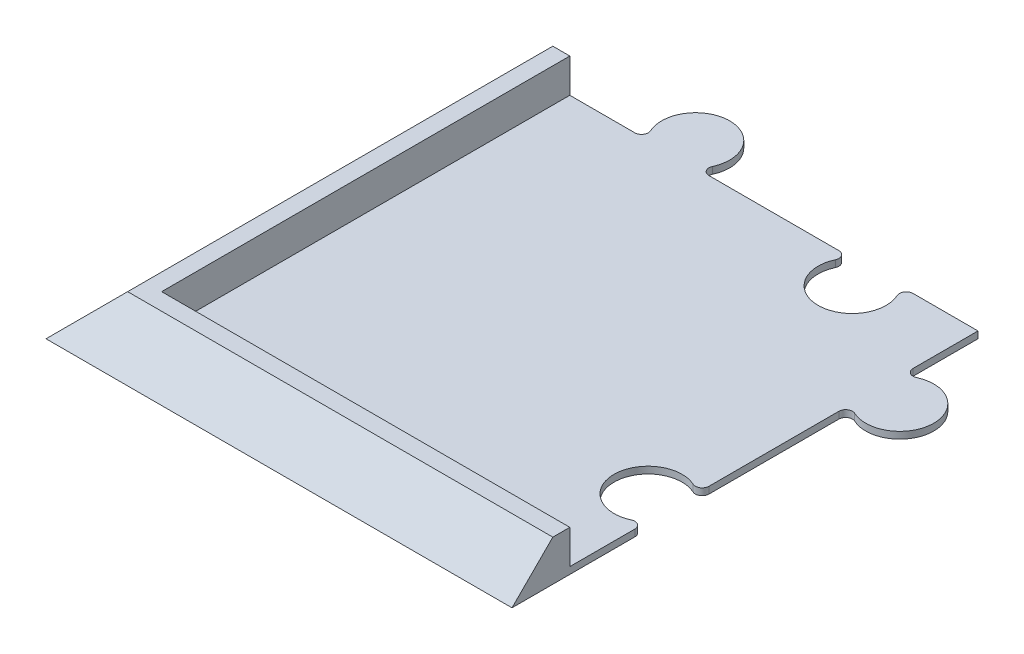
ISO-10303-21;
HEADER;
FILE_DESCRIPTION(('STEP AP214'),'2;1');
FILE_NAME('part.step','',(''),(''),'','','');
FILE_SCHEMA(('AUTOMOTIVE_DESIGN { 1 0 10303 214 1 1 1 1 }'));
ENDSEC;
DATA;
#1=APPLICATION_CONTEXT('core data for automotive mechanical design processes');
#2=APPLICATION_PROTOCOL_DEFINITION('international standard','automotive_design',2000,#1);
#3=PRODUCT_CONTEXT('',#1,'mechanical');
#4=PRODUCT('Part','Part','',(#3));
#5=PRODUCT_RELATED_PRODUCT_CATEGORY('part','',(#4));
#6=PRODUCT_DEFINITION_FORMATION('','',#4);
#7=PRODUCT_DEFINITION_CONTEXT('part definition',#1,'design');
#8=PRODUCT_DEFINITION('design','',#6,#7);
#9=PRODUCT_DEFINITION_SHAPE('','',#8);
#10=(LENGTH_UNIT() NAMED_UNIT(*) SI_UNIT(.MILLI.,.METRE.));
#11=(NAMED_UNIT(*) PLANE_ANGLE_UNIT() SI_UNIT($,.RADIAN.));
#12=(NAMED_UNIT(*) SI_UNIT($,.STERADIAN.) SOLID_ANGLE_UNIT());
#13=UNCERTAINTY_MEASURE_WITH_UNIT(LENGTH_MEASURE(1.E-05),#10,'distance_accuracy_value','');
#14=(GEOMETRIC_REPRESENTATION_CONTEXT(3) GLOBAL_UNCERTAINTY_ASSIGNED_CONTEXT((#13)) GLOBAL_UNIT_ASSIGNED_CONTEXT((#10,
#11,#12)) REPRESENTATION_CONTEXT('',''));
#15=CARTESIAN_POINT('',(0.,0.,0.));
#16=DIRECTION('',(0.,0.,1.));
#17=DIRECTION('',(1.,0.,0.));
#18=AXIS2_PLACEMENT_3D('',#15,#16,#17);
#19=CARTESIAN_POINT('',(0.,2.54,152.4));
#20=DIRECTION('',(1.,0.,0.));
#21=DIRECTION('',(0.,0.,-1.));
#22=AXIS2_PLACEMENT_3D('',#19,#20,#21);
#23=PLANE('',#22);
#24=DIRECTION('',(0.,0.,-1.));
#25=VECTOR('',#24,1.);
#26=CARTESIAN_POINT('',(0.,2.54,152.4));
#27=LINE('',#26,#25);
#28=CARTESIAN_POINT('',(0.,2.54,100.445935614413));
#29=VERTEX_POINT('',#28);
#30=CARTESIAN_POINT('',(0.,2.54,51.9540643855874));
#31=VERTEX_POINT('',#30);
#32=EDGE_CURVE('E283',#29,#31,#27,.T.);
#33=ORIENTED_EDGE('',*,*,#32,.F.);
#34=DIRECTION('',(0.,-1.,0.));
#35=VECTOR('',#34,1.);
#36=CARTESIAN_POINT('',(0.,0.,100.445935614413));
#37=LINE('',#36,#35);
#38=CARTESIAN_POINT('',(0.,0.,100.445935614413));
#39=VERTEX_POINT('',#38);
#40=EDGE_CURVE('E328',#29,#39,#37,.T.);
#41=ORIENTED_EDGE('',*,*,#40,.T.);
#42=DIRECTION('',(0.,0.,-1.));
#43=VECTOR('',#42,1.);
#44=CARTESIAN_POINT('',(0.,0.,152.4));
#45=LINE('',#44,#43);
#46=CARTESIAN_POINT('',(0.,0.,51.9540643855874));
#47=VERTEX_POINT('',#46);
#48=EDGE_CURVE('E277',#39,#47,#45,.T.);
#49=ORIENTED_EDGE('',*,*,#48,.T.);
#50=DIRECTION('',(0.,1.,0.));
#51=VECTOR('',#50,1.);
#52=CARTESIAN_POINT('',(0.,2.54,51.9540643855874));
#53=LINE('',#52,#51);
#54=EDGE_CURVE('E324',#47,#31,#53,.T.);
#55=ORIENTED_EDGE('',*,*,#54,.T.);
#56=EDGE_LOOP('',(#33,#41,#49,#55));
#57=FACE_BOUND('',#56,.T.);
#58=ADVANCED_FACE('F41',(#57),#23,.T.);
#59=CARTESIAN_POINT('',(0.,0.,0.));
#60=DIRECTION('',(0.,0.,-1.));
#61=DIRECTION('',(-1.,0.,0.));
#62=AXIS2_PLACEMENT_3D('',#59,#60,#61);
#63=PLANE('',#62);
#64=DIRECTION('',(1.,0.,0.));
#65=VECTOR('',#64,1.);
#66=CARTESIAN_POINT('',(-152.4,2.54,0.));
#67=LINE('',#66,#65);
#68=CARTESIAN_POINT('',(-100.445935614413,2.54,0.));
#69=VERTEX_POINT('',#68);
#70=CARTESIAN_POINT('',(-51.9540643855874,2.54,0.));
#71=VERTEX_POINT('',#70);
#72=EDGE_CURVE('E260',#69,#71,#67,.T.);
#73=ORIENTED_EDGE('',*,*,#72,.T.);
#74=DIRECTION('',(0.,-1.,0.));
#75=VECTOR('',#74,1.);
#76=CARTESIAN_POINT('',(-51.9540643855874,0.,0.));
#77=LINE('',#76,#75);
#78=CARTESIAN_POINT('',(-51.9540643855874,0.,0.));
#79=VERTEX_POINT('',#78);
#80=EDGE_CURVE('E64',#71,#79,#77,.T.);
#81=ORIENTED_EDGE('',*,*,#80,.T.);
#82=DIRECTION('',(-1.,0.,0.));
#83=VECTOR('',#82,1.);
#84=CARTESIAN_POINT('',(0.,0.,0.));
#85=LINE('',#84,#83);
#86=CARTESIAN_POINT('',(-100.445935614413,0.,0.));
#87=VERTEX_POINT('',#86);
#88=EDGE_CURVE('E269',#79,#87,#85,.T.);
#89=ORIENTED_EDGE('',*,*,#88,.T.);
#90=DIRECTION('',(0.,1.,0.));
#91=VECTOR('',#90,1.);
#92=CARTESIAN_POINT('',(-100.445935614413,0.,0.));
#93=LINE('',#92,#91);
#94=EDGE_CURVE('E352',#87,#69,#93,.T.);
#95=ORIENTED_EDGE('',*,*,#94,.T.);
#96=EDGE_LOOP('',(#73,#81,#89,#95));
#97=FACE_BOUND('',#96,.T.);
#98=ADVANCED_FACE('F505',(#97),#63,.T.);
#99=CARTESIAN_POINT('',(0.,2.54,24.2459356144127));
#100=VERTEX_POINT('',#99);
#101=CARTESIAN_POINT('',(0.,2.54,0.));
#102=VERTEX_POINT('',#101);
#103=EDGE_CURVE('E284',#100,#102,#27,.T.);
#104=ORIENTED_EDGE('',*,*,#103,.F.);
#105=DIRECTION('',(0.,1.,0.));
#106=VECTOR('',#105,1.);
#107=CARTESIAN_POINT('',(0.,2.54,24.2459356144127));
#108=LINE('',#107,#106);
#109=CARTESIAN_POINT('',(0.,0.,24.2459356144127));
#110=VERTEX_POINT('',#109);
#111=EDGE_CURVE('E338',#100,#110,#108,.F.);
#112=ORIENTED_EDGE('',*,*,#111,.T.);
#113=CARTESIAN_POINT('',(0.,0.,0.));
#114=VERTEX_POINT('',#113);
#115=EDGE_CURVE('E278',#110,#114,#45,.T.);
#116=ORIENTED_EDGE('',*,*,#115,.T.);
#117=DIRECTION('',(0.,-1.,0.));
#118=VECTOR('',#117,1.);
#119=CARTESIAN_POINT('',(0.,2.54,0.));
#120=LINE('',#119,#118);
#121=EDGE_CURVE('E259',#102,#114,#120,.T.);
#122=ORIENTED_EDGE('',*,*,#121,.F.);
#123=EDGE_LOOP('',(#104,#112,#116,#122));
#124=FACE_BOUND('',#123,.T.);
#125=ADVANCED_FACE('F475',(#124),#23,.T.);
#126=CARTESIAN_POINT('',(0.,0.,173.99));
#127=VERTEX_POINT('',#126);
#128=CARTESIAN_POINT('',(0.,0.,128.154064385587));
#129=VERTEX_POINT('',#128);
#130=EDGE_CURVE('E210',#127,#129,#45,.T.);
#131=ORIENTED_EDGE('',*,*,#130,.T.);
#132=DIRECTION('',(0.,-1.,0.));
#133=VECTOR('',#132,1.);
#134=CARTESIAN_POINT('',(0.,2.54,128.154064385587));
#135=LINE('',#134,#133);
#136=CARTESIAN_POINT('',(0.,2.54,128.154064385587));
#137=VERTEX_POINT('',#136);
#138=EDGE_CURVE('E273',#129,#137,#135,.F.);
#139=ORIENTED_EDGE('',*,*,#138,.T.);
#140=CARTESIAN_POINT('',(0.,2.54,152.4));
#141=VERTEX_POINT('',#140);
#142=EDGE_CURVE('E279',#141,#137,#27,.T.);
#143=ORIENTED_EDGE('',*,*,#142,.F.);
#144=DIRECTION('',(0.,1.,0.));
#145=VECTOR('',#144,1.);
#146=CARTESIAN_POINT('',(0.,2.54,152.4));
#147=LINE('',#146,#145);
#148=CARTESIAN_POINT('',(0.,15.24,152.4));
#149=VERTEX_POINT('',#148);
#150=EDGE_CURVE('E220',#141,#149,#147,.T.);
#151=ORIENTED_EDGE('',*,*,#150,.T.);
#152=DIRECTION('',(0.,0.,1.));
#153=VECTOR('',#152,1.);
#154=CARTESIAN_POINT('',(0.,15.24,152.4));
#155=LINE('',#154,#153);
#156=CARTESIAN_POINT('',(0.,15.24,158.75));
#157=VERTEX_POINT('',#156);
#158=EDGE_CURVE('E414',#149,#157,#155,.T.);
#159=ORIENTED_EDGE('',*,*,#158,.T.);
#160=DIRECTION('',(0.,-0.707106781186544,0.707106781186551));
#161=VECTOR('',#160,1.);
#162=CARTESIAN_POINT('',(0.,15.24,158.75));
#163=LINE('',#162,#161);
#164=EDGE_CURVE('E237',#157,#127,#163,.T.);
#165=ORIENTED_EDGE('',*,*,#164,.T.);
#166=EDGE_LOOP('',(#131,#139,#143,#151,#159,#165));
#167=FACE_BOUND('',#166,.T.);
#168=ADVANCED_FACE('F420',(#167),#23,.T.);
#169=CARTESIAN_POINT('',(-152.4,2.54,0.));
#170=VERTEX_POINT('',#169);
#171=CARTESIAN_POINT('',(-128.154064385587,2.54,0.));
#172=VERTEX_POINT('',#171);
#173=EDGE_CURVE('E255',#170,#172,#67,.T.);
#174=ORIENTED_EDGE('',*,*,#173,.T.);
#175=DIRECTION('',(0.,1.,0.));
#176=VECTOR('',#175,1.);
#177=CARTESIAN_POINT('',(-128.154064385587,0.,0.));
#178=LINE('',#177,#176);
#179=CARTESIAN_POINT('',(-128.154064385587,0.,0.));
#180=VERTEX_POINT('',#179);
#181=EDGE_CURVE('E365',#172,#180,#178,.F.);
#182=ORIENTED_EDGE('',*,*,#181,.T.);
#183=CARTESIAN_POINT('',(-173.99,0.,0.));
#184=VERTEX_POINT('',#183);
#185=EDGE_CURVE('E264',#180,#184,#85,.T.);
#186=ORIENTED_EDGE('',*,*,#185,.T.);
#187=DIRECTION('',(0.707106781186551,0.707106781186544,0.));
#188=VECTOR('',#187,1.);
#189=CARTESIAN_POINT('',(-173.99,0.,0.));
#190=LINE('',#189,#188);
#191=CARTESIAN_POINT('',(-158.75,15.24,0.));
#192=VERTEX_POINT('',#191);
#193=EDGE_CURVE('E205',#184,#192,#190,.T.);
#194=ORIENTED_EDGE('',*,*,#193,.T.);
#195=DIRECTION('',(1.,0.,0.));
#196=VECTOR('',#195,1.);
#197=CARTESIAN_POINT('',(-158.75,15.24,0.));
#198=LINE('',#197,#196);
#199=CARTESIAN_POINT('',(-152.4,15.24,0.));
#200=VERTEX_POINT('',#199);
#201=EDGE_CURVE('E227',#192,#200,#198,.T.);
#202=ORIENTED_EDGE('',*,*,#201,.T.);
#203=DIRECTION('',(0.,-1.,0.));
#204=VECTOR('',#203,1.);
#205=CARTESIAN_POINT('',(-152.4,15.24,0.));
#206=LINE('',#205,#204);
#207=EDGE_CURVE('E232',#200,#170,#206,.T.);
#208=ORIENTED_EDGE('',*,*,#207,.T.);
#209=EDGE_LOOP('',(#174,#182,#186,#194,#202,#208));
#210=FACE_BOUND('',#209,.T.);
#211=ADVANCED_FACE('F396',(#210),#63,.T.);
#212=CARTESIAN_POINT('',(-24.2459356144126,0.,0.));
#213=VERTEX_POINT('',#212);
#214=EDGE_CURVE('E265',#114,#213,#85,.T.);
#215=ORIENTED_EDGE('',*,*,#214,.T.);
#216=DIRECTION('',(0.,-1.,0.));
#217=VECTOR('',#216,1.);
#218=CARTESIAN_POINT('',(-24.2459356144126,2.54,0.));
#219=LINE('',#218,#217);
#220=CARTESIAN_POINT('',(-24.2459356144127,2.54,0.));
#221=VERTEX_POINT('',#220);
#222=EDGE_CURVE('E341',#213,#221,#219,.F.);
#223=ORIENTED_EDGE('',*,*,#222,.T.);
#224=EDGE_CURVE('E254',#221,#102,#67,.T.);
#225=ORIENTED_EDGE('',*,*,#224,.T.);
#226=ORIENTED_EDGE('',*,*,#121,.T.);
#227=EDGE_LOOP('',(#215,#223,#225,#226));
#228=FACE_BOUND('',#227,.T.);
#229=ADVANCED_FACE('F469',(#228),#63,.T.);
#230=CARTESIAN_POINT('',(-158.75,15.24,152.4));
#231=DIRECTION('',(0.,1.,0.));
#232=DIRECTION('',(-1.,0.,0.));
#233=AXIS2_PLACEMENT_3D('',#230,#231,#232);
#234=PLANE('',#233);
#235=DIRECTION('',(0.,0.,-1.));
#236=VECTOR('',#235,1.);
#237=CARTESIAN_POINT('',(-158.75,15.24,152.4));
#238=LINE('',#237,#236);
#239=CARTESIAN_POINT('',(-158.75,15.24,158.75));
#240=VERTEX_POINT('',#239);
#241=EDGE_CURVE('E209',#240,#192,#238,.T.);
#242=ORIENTED_EDGE('',*,*,#241,.F.);
#243=DIRECTION('',(1.,0.,0.));
#244=VECTOR('',#243,1.);
#245=CARTESIAN_POINT('',(-173.99,15.24,158.75));
#246=LINE('',#245,#244);
#247=EDGE_CURVE('E218',#240,#157,#246,.T.);
#248=ORIENTED_EDGE('',*,*,#247,.T.);
#249=ORIENTED_EDGE('',*,*,#158,.F.);
#250=DIRECTION('',(1.,0.,0.));
#251=VECTOR('',#250,1.);
#252=CARTESIAN_POINT('',(-173.99,15.24,152.4));
#253=LINE('',#252,#251);
#254=CARTESIAN_POINT('',(-152.4,15.24,152.4));
#255=VERTEX_POINT('',#254);
#256=EDGE_CURVE('E234',#255,#149,#253,.T.);
#257=ORIENTED_EDGE('',*,*,#256,.F.);
#258=DIRECTION('',(0.,0.,-1.));
#259=VECTOR('',#258,1.);
#260=CARTESIAN_POINT('',(-152.4,15.24,152.4));
#261=LINE('',#260,#259);
#262=EDGE_CURVE('E249',#255,#200,#261,.T.);
#263=ORIENTED_EDGE('',*,*,#262,.T.);
#264=ORIENTED_EDGE('',*,*,#201,.F.);
#265=EDGE_LOOP('',(#242,#248,#249,#257,#263,#264));
#266=FACE_BOUND('',#265,.T.);
#267=ADVANCED_FACE('F534',(#266),#234,.T.);
#268=CARTESIAN_POINT('',(-173.99,0.,152.4));
#269=DIRECTION('',(-0.707106781186544,0.707106781186551,0.));
#270=DIRECTION('',(-0.707106781186551,-0.707106781186544,0.));
#271=AXIS2_PLACEMENT_3D('',#268,#269,#270);
#272=PLANE('',#271);
#273=ORIENTED_EDGE('',*,*,#193,.F.);
#274=DIRECTION('',(0.,0.,-1.));
#275=VECTOR('',#274,1.);
#276=CARTESIAN_POINT('',(-173.99,0.,152.4));
#277=LINE('',#276,#275);
#278=CARTESIAN_POINT('',(-173.99,0.,173.99));
#279=VERTEX_POINT('',#278);
#280=EDGE_CURVE('E199',#279,#184,#277,.T.);
#281=ORIENTED_EDGE('',*,*,#280,.F.);
#282=DIRECTION('',(0.577350269189628,0.577350269189621,-0.577350269189628));
#283=VECTOR('',#282,1.);
#284=CARTESIAN_POINT('',(-163.83,10.16,163.83));
#285=LINE('',#284,#283);
#286=EDGE_CURVE('E202',#279,#240,#285,.T.);
#287=ORIENTED_EDGE('',*,*,#286,.T.);
#288=ORIENTED_EDGE('',*,*,#241,.T.);
#289=EDGE_LOOP('',(#273,#281,#287,#288));
#290=FACE_BOUND('',#289,.T.);
#291=ADVANCED_FACE('F201',(#290),#272,.T.);
#292=CARTESIAN_POINT('',(0.,0.,152.4));
#293=DIRECTION('',(0.,-1.,0.));
#294=DIRECTION('',(1.,0.,0.));
#295=AXIS2_PLACEMENT_3D('',#292,#293,#294);
#296=PLANE('',#295);
#297=CARTESIAN_POINT('',(-8.89,0.,114.3));
#298=DIRECTION('',(0.,1.,0.));
#299=DIRECTION('',(0.,0.,1.));
#300=AXIS2_PLACEMENT_3D('',#297,#298,#299);
#301=CIRCLE('',#300,12.7);
#302=CARTESIAN_POINT('',(-3.59833333333334,0.,102.754946345344));
#303=VERTEX_POINT('',#302);
#304=CARTESIAN_POINT('',(-3.59833333333333,0.,125.845053654656));
#305=VERTEX_POINT('',#304);
#306=EDGE_CURVE('E435',#303,#305,#301,.T.);
#307=ORIENTED_EDGE('',*,*,#306,.T.);
#308=CARTESIAN_POINT('',(-2.54,0.,128.154064385587));
#309=DIRECTION('',(0.,-1.,0.));
#310=DIRECTION('',(1.,0.,0.));
#311=AXIS2_PLACEMENT_3D('',#308,#309,#310);
#312=CIRCLE('',#311,2.54);
#313=EDGE_CURVE('E321',#305,#129,#312,.T.);
#314=ORIENTED_EDGE('',*,*,#313,.T.);
#315=ORIENTED_EDGE('',*,*,#130,.F.);
#316=DIRECTION('',(1.,0.,0.));
#317=VECTOR('',#316,1.);
#318=CARTESIAN_POINT('',(-173.99,0.,173.99));
#319=LINE('',#318,#317);
#320=EDGE_CURVE('E216',#279,#127,#319,.T.);
#321=ORIENTED_EDGE('',*,*,#320,.F.);
#322=ORIENTED_EDGE('',*,*,#280,.T.);
#323=ORIENTED_EDGE('',*,*,#185,.F.);
#324=CARTESIAN_POINT('',(-128.154064385587,0.,-2.54));
#325=DIRECTION('',(0.,-1.,0.));
#326=DIRECTION('',(1.,0.,0.));
#327=AXIS2_PLACEMENT_3D('',#324,#325,#326);
#328=CIRCLE('',#327,2.54);
#329=CARTESIAN_POINT('',(-125.845053654656,0.,-3.59833333333334));
#330=VERTEX_POINT('',#329);
#331=EDGE_CURVE('E11',#180,#330,#328,.F.);
#332=ORIENTED_EDGE('',*,*,#331,.T.);
#333=CARTESIAN_POINT('',(-114.3,0.,-8.89));
#334=DIRECTION('',(0.,1.,0.));
#335=DIRECTION('',(0.,0.,1.));
#336=AXIS2_PLACEMENT_3D('',#333,#334,#335);
#337=CIRCLE('',#336,12.7);
#338=CARTESIAN_POINT('',(-102.754946345344,0.,-3.59833333333333));
#339=VERTEX_POINT('',#338);
#340=EDGE_CURVE('E221',#330,#339,#337,.F.);
#341=ORIENTED_EDGE('',*,*,#340,.T.);
#342=CARTESIAN_POINT('',(-100.445935614413,0.,-2.54));
#343=DIRECTION('',(0.,-1.,0.));
#344=DIRECTION('',(1.,0.,0.));
#345=AXIS2_PLACEMENT_3D('',#342,#343,#344);
#346=CIRCLE('',#345,2.54);
#347=EDGE_CURVE('E57',#339,#87,#346,.F.);
#348=ORIENTED_EDGE('',*,*,#347,.T.);
#349=ORIENTED_EDGE('',*,*,#88,.F.);
#350=CARTESIAN_POINT('',(-51.9540643855874,0.,2.54));
#351=DIRECTION('',(0.,-1.,0.));
#352=DIRECTION('',(1.,0.,0.));
#353=AXIS2_PLACEMENT_3D('',#350,#351,#352);
#354=CIRCLE('',#353,2.54);
#355=CARTESIAN_POINT('',(-49.6450536546561,0.,3.59833333333333));
#356=VERTEX_POINT('',#355);
#357=EDGE_CURVE('E312',#79,#356,#354,.T.);
#358=ORIENTED_EDGE('',*,*,#357,.T.);
#359=CARTESIAN_POINT('',(-38.1,0.,8.88999999999999));
#360=DIRECTION('',(0.,1.,0.));
#361=DIRECTION('',(0.,0.,1.));
#362=AXIS2_PLACEMENT_3D('',#359,#360,#361);
#363=CIRCLE('',#362,12.7);
#364=CARTESIAN_POINT('',(-26.5549463453439,0.,3.59833333333333));
#365=VERTEX_POINT('',#364);
#366=EDGE_CURVE('E447',#356,#365,#363,.T.);
#367=ORIENTED_EDGE('',*,*,#366,.T.);
#368=CARTESIAN_POINT('',(-24.2459356144126,0.,2.54));
#369=DIRECTION('',(0.,-1.,0.));
#370=DIRECTION('',(1.,0.,0.));
#371=AXIS2_PLACEMENT_3D('',#368,#369,#370);
#372=CIRCLE('',#371,2.54);
#373=EDGE_CURVE('E315',#365,#213,#372,.T.);
#374=ORIENTED_EDGE('',*,*,#373,.T.);
#375=ORIENTED_EDGE('',*,*,#214,.F.);
#376=ORIENTED_EDGE('',*,*,#115,.F.);
#377=CARTESIAN_POINT('',(2.54,0.,24.2459356144126));
#378=DIRECTION('',(0.,-1.,0.));
#379=DIRECTION('',(1.,0.,0.));
#380=AXIS2_PLACEMENT_3D('',#377,#378,#379);
#381=CIRCLE('',#380,2.54);
#382=CARTESIAN_POINT('',(3.59833333333333,0.,26.5549463453439));
#383=VERTEX_POINT('',#382);
#384=EDGE_CURVE('E377',#110,#383,#381,.F.);
#385=ORIENTED_EDGE('',*,*,#384,.T.);
#386=CARTESIAN_POINT('',(8.89,0.,38.1));
#387=DIRECTION('',(0.,1.,0.));
#388=DIRECTION('',(0.,0.,1.));
#389=AXIS2_PLACEMENT_3D('',#386,#387,#388);
#390=CIRCLE('',#389,12.7);
#391=CARTESIAN_POINT('',(3.59833333333333,0.,49.6450536546561));
#392=VERTEX_POINT('',#391);
#393=EDGE_CURVE('E406',#383,#392,#390,.F.);
#394=ORIENTED_EDGE('',*,*,#393,.T.);
#395=CARTESIAN_POINT('',(2.54,0.,51.9540643855874));
#396=DIRECTION('',(0.,-1.,0.));
#397=DIRECTION('',(1.,0.,0.));
#398=AXIS2_PLACEMENT_3D('',#395,#396,#397);
#399=CIRCLE('',#398,2.54);
#400=EDGE_CURVE('E371',#392,#47,#399,.F.);
#401=ORIENTED_EDGE('',*,*,#400,.T.);
#402=ORIENTED_EDGE('',*,*,#48,.F.);
#403=CARTESIAN_POINT('',(-2.54,0.,100.445935614413));
#404=DIRECTION('',(0.,-1.,0.));
#405=DIRECTION('',(1.,0.,0.));
#406=AXIS2_PLACEMENT_3D('',#403,#404,#405);
#407=CIRCLE('',#406,2.54);
#408=EDGE_CURVE('E318',#39,#303,#407,.T.);
#409=ORIENTED_EDGE('',*,*,#408,.T.);
#410=EDGE_LOOP('',(#307,#314,#315,#321,#322,#323,#332,#341,#348,#349,#358,#367,#374,#375,#376,
#385,#394,#401,#402,#409));
#411=FACE_BOUND('',#410,.T.);
#412=ADVANCED_FACE('F224',(#411),#296,.T.);
#413=CARTESIAN_POINT('',(-152.4,2.54,152.4));
#414=DIRECTION('',(0.,1.,0.));
#415=DIRECTION('',(0.,0.,1.));
#416=AXIS2_PLACEMENT_3D('',#413,#414,#415);
#417=PLANE('',#416);
#418=ORIENTED_EDGE('',*,*,#142,.T.);
#419=CARTESIAN_POINT('',(-2.54,2.54,128.154064385587));
#420=DIRECTION('',(0.,1.,0.));
#421=DIRECTION('',(0.,0.,1.));
#422=AXIS2_PLACEMENT_3D('',#419,#420,#421);
#423=CIRCLE('',#422,2.54);
#424=CARTESIAN_POINT('',(-3.59833333333333,2.54,125.845053654656));
#425=VERTEX_POINT('',#424);
#426=EDGE_CURVE('E302',#137,#425,#423,.T.);
#427=ORIENTED_EDGE('',*,*,#426,.T.);
#428=CARTESIAN_POINT('',(-8.89,2.54,114.3));
#429=DIRECTION('',(0.,1.,0.));
#430=DIRECTION('',(0.,0.,1.));
#431=AXIS2_PLACEMENT_3D('',#428,#429,#430);
#432=CIRCLE('',#431,12.7);
#433=CARTESIAN_POINT('',(-3.59833333333334,2.54,102.754946345344));
#434=VERTEX_POINT('',#433);
#435=EDGE_CURVE('E429',#434,#425,#432,.T.);
#436=ORIENTED_EDGE('',*,*,#435,.F.);
#437=CARTESIAN_POINT('',(-2.54,2.54,100.445935614413));
#438=DIRECTION('',(0.,1.,0.));
#439=DIRECTION('',(0.,0.,1.));
#440=AXIS2_PLACEMENT_3D('',#437,#438,#439);
#441=CIRCLE('',#440,2.54);
#442=EDGE_CURVE('E299',#434,#29,#441,.T.);
#443=ORIENTED_EDGE('',*,*,#442,.T.);
#444=ORIENTED_EDGE('',*,*,#32,.T.);
#445=CARTESIAN_POINT('',(2.54,2.54,51.9540643855874));
#446=DIRECTION('',(0.,1.,0.));
#447=DIRECTION('',(0.,0.,1.));
#448=AXIS2_PLACEMENT_3D('',#445,#446,#447);
#449=CIRCLE('',#448,2.54);
#450=CARTESIAN_POINT('',(3.59833333333333,2.54,49.6450536546561));
#451=VERTEX_POINT('',#450);
#452=EDGE_CURVE('E368',#31,#451,#449,.F.);
#453=ORIENTED_EDGE('',*,*,#452,.T.);
#454=CARTESIAN_POINT('',(8.89,2.54,38.1));
#455=DIRECTION('',(0.,1.,0.));
#456=DIRECTION('',(0.,0.,1.));
#457=AXIS2_PLACEMENT_3D('',#454,#455,#456);
#458=CIRCLE('',#457,12.7);
#459=CARTESIAN_POINT('',(3.59833333333333,2.54,26.5549463453439));
#460=VERTEX_POINT('',#459);
#461=EDGE_CURVE('E409',#460,#451,#458,.F.);
#462=ORIENTED_EDGE('',*,*,#461,.F.);
#463=CARTESIAN_POINT('',(2.54,2.54,24.2459356144126));
#464=DIRECTION('',(0.,1.,0.));
#465=DIRECTION('',(0.,0.,1.));
#466=AXIS2_PLACEMENT_3D('',#463,#464,#465);
#467=CIRCLE('',#466,2.54);
#468=EDGE_CURVE('E374',#460,#100,#467,.F.);
#469=ORIENTED_EDGE('',*,*,#468,.T.);
#470=ORIENTED_EDGE('',*,*,#103,.T.);
#471=ORIENTED_EDGE('',*,*,#224,.F.);
#472=CARTESIAN_POINT('',(-24.2459356144126,2.54,2.54));
#473=DIRECTION('',(0.,1.,0.));
#474=DIRECTION('',(0.,0.,1.));
#475=AXIS2_PLACEMENT_3D('',#472,#473,#474);
#476=CIRCLE('',#475,2.54);
#477=CARTESIAN_POINT('',(-26.5549463453439,2.54,3.59833333333333));
#478=VERTEX_POINT('',#477);
#479=EDGE_CURVE('E296',#221,#478,#476,.T.);
#480=ORIENTED_EDGE('',*,*,#479,.T.);
#481=CARTESIAN_POINT('',(-38.1,2.54,8.88999999999999));
#482=DIRECTION('',(0.,1.,0.));
#483=DIRECTION('',(0.,0.,1.));
#484=AXIS2_PLACEMENT_3D('',#481,#482,#483);
#485=CIRCLE('',#484,12.7);
#486=CARTESIAN_POINT('',(-49.6450536546561,2.54,3.59833333333333));
#487=VERTEX_POINT('',#486);
#488=EDGE_CURVE('E438',#487,#478,#485,.T.);
#489=ORIENTED_EDGE('',*,*,#488,.F.);
#490=CARTESIAN_POINT('',(-51.9540643855874,2.54,2.54));
#491=DIRECTION('',(0.,1.,0.));
#492=DIRECTION('',(0.,0.,1.));
#493=AXIS2_PLACEMENT_3D('',#490,#491,#492);
#494=CIRCLE('',#493,2.54);
#495=EDGE_CURVE('E293',#487,#71,#494,.T.);
#496=ORIENTED_EDGE('',*,*,#495,.T.);
#497=ORIENTED_EDGE('',*,*,#72,.F.);
#498=CARTESIAN_POINT('',(-100.445935614413,2.54,-2.54));
#499=DIRECTION('',(0.,1.,0.));
#500=DIRECTION('',(0.,0.,1.));
#501=AXIS2_PLACEMENT_3D('',#498,#499,#500);
#502=CIRCLE('',#501,2.54);
#503=CARTESIAN_POINT('',(-102.754946345344,2.54,-3.59833333333333));
#504=VERTEX_POINT('',#503);
#505=EDGE_CURVE('E380',#69,#504,#502,.F.);
#506=ORIENTED_EDGE('',*,*,#505,.T.);
#507=CARTESIAN_POINT('',(-114.3,2.54,-8.89));
#508=DIRECTION('',(0.,1.,0.));
#509=DIRECTION('',(0.,0.,1.));
#510=AXIS2_PLACEMENT_3D('',#507,#508,#509);
#511=CIRCLE('',#510,12.7);
#512=CARTESIAN_POINT('',(-125.845053654656,2.54,-3.59833333333334));
#513=VERTEX_POINT('',#512);
#514=EDGE_CURVE('E391',#513,#504,#511,.F.);
#515=ORIENTED_EDGE('',*,*,#514,.F.);
#516=CARTESIAN_POINT('',(-128.154064385587,2.54,-2.54));
#517=DIRECTION('',(0.,1.,0.));
#518=DIRECTION('',(0.,0.,1.));
#519=AXIS2_PLACEMENT_3D('',#516,#517,#518);
#520=CIRCLE('',#519,2.54);
#521=EDGE_CURVE('E50',#513,#172,#520,.F.);
#522=ORIENTED_EDGE('',*,*,#521,.T.);
#523=ORIENTED_EDGE('',*,*,#173,.F.);
#524=DIRECTION('',(0.,0.,-1.));
#525=VECTOR('',#524,1.);
#526=CARTESIAN_POINT('',(-152.4,2.54,152.4));
#527=LINE('',#526,#525);
#528=CARTESIAN_POINT('',(-152.4,2.54,152.4));
#529=VERTEX_POINT('',#528);
#530=EDGE_CURVE('E285',#529,#170,#527,.T.);
#531=ORIENTED_EDGE('',*,*,#530,.F.);
#532=DIRECTION('',(1.,0.,0.));
#533=VECTOR('',#532,1.);
#534=CARTESIAN_POINT('',(-152.4,2.54,152.4));
#535=LINE('',#534,#533);
#536=EDGE_CURVE('E246',#529,#141,#535,.T.);
#537=ORIENTED_EDGE('',*,*,#536,.T.);
#538=EDGE_LOOP('',(#418,#427,#436,#443,#444,#453,#462,#469,#470,#471,#480,#489,#496,#497,#506,
#515,#522,#523,#531,#537));
#539=FACE_BOUND('',#538,.T.);
#540=ADVANCED_FACE('F388',(#539),#417,.T.);
#541=CARTESIAN_POINT('',(-152.4,15.24,152.4));
#542=DIRECTION('',(1.,0.,0.));
#543=DIRECTION('',(0.,0.,-1.));
#544=AXIS2_PLACEMENT_3D('',#541,#542,#543);
#545=PLANE('',#544);
#546=ORIENTED_EDGE('',*,*,#207,.F.);
#547=ORIENTED_EDGE('',*,*,#262,.F.);
#548=DIRECTION('',(0.,-1.,0.));
#549=VECTOR('',#548,1.);
#550=CARTESIAN_POINT('',(-152.4,15.24,152.4));
#551=LINE('',#550,#549);
#552=EDGE_CURVE('E242',#255,#529,#551,.T.);
#553=ORIENTED_EDGE('',*,*,#552,.T.);
#554=ORIENTED_EDGE('',*,*,#530,.T.);
#555=EDGE_LOOP('',(#546,#547,#553,#554));
#556=FACE_BOUND('',#555,.T.);
#557=ADVANCED_FACE('F560',(#556),#545,.T.);
#558=CARTESIAN_POINT('',(-173.99,2.54,152.4));
#559=DIRECTION('',(0.,0.,-1.));
#560=DIRECTION('',(-1.,0.,0.));
#561=AXIS2_PLACEMENT_3D('',#558,#559,#560);
#562=PLANE('',#561);
#563=ORIENTED_EDGE('',*,*,#536,.F.);
#564=ORIENTED_EDGE('',*,*,#552,.F.);
#565=ORIENTED_EDGE('',*,*,#256,.T.);
#566=ORIENTED_EDGE('',*,*,#150,.F.);
#567=EDGE_LOOP('',(#563,#564,#565,#566));
#568=FACE_BOUND('',#567,.T.);
#569=ADVANCED_FACE('F567',(#568),#562,.T.);
#570=CARTESIAN_POINT('',(-173.99,15.24,158.75));
#571=DIRECTION('',(0.,0.707106781186551,0.707106781186544));
#572=DIRECTION('',(0.,-0.707106781186544,0.707106781186551));
#573=AXIS2_PLACEMENT_3D('',#570,#571,#572);
#574=PLANE('',#573);
#575=ORIENTED_EDGE('',*,*,#286,.F.);
#576=ORIENTED_EDGE('',*,*,#320,.T.);
#577=ORIENTED_EDGE('',*,*,#164,.F.);
#578=ORIENTED_EDGE('',*,*,#247,.F.);
#579=EDGE_LOOP('',(#575,#576,#577,#578));
#580=FACE_BOUND('',#579,.T.);
#581=ADVANCED_FACE('F214',(#580),#574,.T.);
#582=CARTESIAN_POINT('',(-114.3,0.,-8.89));
#583=DIRECTION('',(0.,1.,0.));
#584=DIRECTION('',(0.,0.,1.));
#585=AXIS2_PLACEMENT_3D('',#582,#583,#584);
#586=CYLINDRICAL_SURFACE('',#585,12.7);
#587=ORIENTED_EDGE('',*,*,#514,.T.);
#588=DIRECTION('',(0.,1.,0.));
#589=VECTOR('',#588,1.);
#590=CARTESIAN_POINT('',(-102.754946345344,0.,-3.59833333333333));
#591=LINE('',#590,#589);
#592=EDGE_CURVE('E362',#504,#339,#591,.F.);
#593=ORIENTED_EDGE('',*,*,#592,.T.);
#594=ORIENTED_EDGE('',*,*,#340,.F.);
#595=DIRECTION('',(0.,1.,0.));
#596=VECTOR('',#595,1.);
#597=CARTESIAN_POINT('',(-125.845053654656,0.,-3.59833333333334));
#598=LINE('',#597,#596);
#599=EDGE_CURVE('E358',#330,#513,#598,.T.);
#600=ORIENTED_EDGE('',*,*,#599,.T.);
#601=EDGE_LOOP('',(#587,#593,#594,#600));
#602=FACE_BOUND('',#601,.T.);
#603=ADVANCED_FACE('F401',(#602),#586,.T.);
#604=CARTESIAN_POINT('',(8.89,0.,38.1));
#605=DIRECTION('',(0.,1.,0.));
#606=DIRECTION('',(0.,0.,1.));
#607=AXIS2_PLACEMENT_3D('',#604,#605,#606);
#608=CYLINDRICAL_SURFACE('',#607,12.7);
#609=ORIENTED_EDGE('',*,*,#461,.T.);
#610=DIRECTION('',(0.,1.,0.));
#611=VECTOR('',#610,1.);
#612=CARTESIAN_POINT('',(3.59833333333333,0.,49.6450536546561));
#613=LINE('',#612,#611);
#614=EDGE_CURVE('E335',#451,#392,#613,.F.);
#615=ORIENTED_EDGE('',*,*,#614,.T.);
#616=ORIENTED_EDGE('',*,*,#393,.F.);
#617=DIRECTION('',(0.,1.,0.));
#618=VECTOR('',#617,1.);
#619=CARTESIAN_POINT('',(3.59833333333333,0.,26.5549463453439));
#620=LINE('',#619,#618);
#621=EDGE_CURVE('E331',#383,#460,#620,.T.);
#622=ORIENTED_EDGE('',*,*,#621,.T.);
#623=EDGE_LOOP('',(#609,#615,#616,#622));
#624=FACE_BOUND('',#623,.T.);
#625=ADVANCED_FACE('F495',(#624),#608,.T.);
#626=CARTESIAN_POINT('',(-8.89,0.,114.3));
#627=DIRECTION('',(0.,1.,0.));
#628=DIRECTION('',(0.,0.,1.));
#629=AXIS2_PLACEMENT_3D('',#626,#627,#628);
#630=CYLINDRICAL_SURFACE('',#629,12.7);
#631=ORIENTED_EDGE('',*,*,#435,.T.);
#632=DIRECTION('',(0.,1.,0.));
#633=VECTOR('',#632,1.);
#634=CARTESIAN_POINT('',(-3.59833333333333,0.,125.845053654656));
#635=LINE('',#634,#633);
#636=EDGE_CURVE('E309',#425,#305,#635,.F.);
#637=ORIENTED_EDGE('',*,*,#636,.T.);
#638=ORIENTED_EDGE('',*,*,#306,.F.);
#639=DIRECTION('',(0.,1.,0.));
#640=VECTOR('',#639,1.);
#641=CARTESIAN_POINT('',(-3.59833333333334,0.,102.754946345344));
#642=LINE('',#641,#640);
#643=EDGE_CURVE('E305',#303,#434,#642,.T.);
#644=ORIENTED_EDGE('',*,*,#643,.T.);
#645=EDGE_LOOP('',(#631,#637,#638,#644));
#646=FACE_BOUND('',#645,.T.);
#647=ADVANCED_FACE('F431',(#646),#630,.F.);
#648=CARTESIAN_POINT('',(-38.1,0.,8.88999999999999));
#649=DIRECTION('',(0.,1.,0.));
#650=DIRECTION('',(0.,0.,1.));
#651=AXIS2_PLACEMENT_3D('',#648,#649,#650);
#652=CYLINDRICAL_SURFACE('',#651,12.7);
#653=ORIENTED_EDGE('',*,*,#488,.T.);
#654=DIRECTION('',(0.,1.,0.));
#655=VECTOR('',#654,1.);
#656=CARTESIAN_POINT('',(-26.5549463453439,0.,3.59833333333333));
#657=LINE('',#656,#655);
#658=EDGE_CURVE('E349',#478,#365,#657,.F.);
#659=ORIENTED_EDGE('',*,*,#658,.T.);
#660=ORIENTED_EDGE('',*,*,#366,.F.);
#661=DIRECTION('',(0.,1.,0.));
#662=VECTOR('',#661,1.);
#663=CARTESIAN_POINT('',(-49.6450536546561,0.,3.59833333333333));
#664=LINE('',#663,#662);
#665=EDGE_CURVE('E345',#356,#487,#664,.T.);
#666=ORIENTED_EDGE('',*,*,#665,.T.);
#667=EDGE_LOOP('',(#653,#659,#660,#666));
#668=FACE_BOUND('',#667,.T.);
#669=ADVANCED_FACE('F461',(#668),#652,.F.);
#670=CARTESIAN_POINT('',(-2.54,0.,128.154064385587));
#671=DIRECTION('',(0.,1.,0.));
#672=DIRECTION('',(0.,0.,1.));
#673=AXIS2_PLACEMENT_3D('',#670,#671,#672);
#674=CYLINDRICAL_SURFACE('',#673,2.54);
#675=ORIENTED_EDGE('',*,*,#313,.F.);
#676=ORIENTED_EDGE('',*,*,#636,.F.);
#677=ORIENTED_EDGE('',*,*,#426,.F.);
#678=ORIENTED_EDGE('',*,*,#138,.F.);
#679=EDGE_LOOP('',(#675,#676,#677,#678));
#680=FACE_BOUND('',#679,.T.);
#681=ADVANCED_FACE('F425',(#680),#674,.T.);
#682=CARTESIAN_POINT('',(-2.54,0.,100.445935614413));
#683=DIRECTION('',(0.,1.,0.));
#684=DIRECTION('',(0.,0.,1.));
#685=AXIS2_PLACEMENT_3D('',#682,#683,#684);
#686=CYLINDRICAL_SURFACE('',#685,2.54);
#687=ORIENTED_EDGE('',*,*,#408,.F.);
#688=ORIENTED_EDGE('',*,*,#40,.F.);
#689=ORIENTED_EDGE('',*,*,#442,.F.);
#690=ORIENTED_EDGE('',*,*,#643,.F.);
#691=EDGE_LOOP('',(#687,#688,#689,#690));
#692=FACE_BOUND('',#691,.T.);
#693=ADVANCED_FACE('F612',(#692),#686,.T.);
#694=CARTESIAN_POINT('',(2.54,0.,51.9540643855874));
#695=DIRECTION('',(0.,1.,0.));
#696=DIRECTION('',(0.,0.,1.));
#697=AXIS2_PLACEMENT_3D('',#694,#695,#696);
#698=CYLINDRICAL_SURFACE('',#697,2.54);
#699=ORIENTED_EDGE('',*,*,#400,.F.);
#700=ORIENTED_EDGE('',*,*,#614,.F.);
#701=ORIENTED_EDGE('',*,*,#452,.F.);
#702=ORIENTED_EDGE('',*,*,#54,.F.);
#703=EDGE_LOOP('',(#699,#700,#701,#702));
#704=FACE_BOUND('',#703,.T.);
#705=ADVANCED_FACE('F489',(#704),#698,.F.);
#706=CARTESIAN_POINT('',(2.54,0.,24.2459356144126));
#707=DIRECTION('',(0.,1.,0.));
#708=DIRECTION('',(0.,0.,1.));
#709=AXIS2_PLACEMENT_3D('',#706,#707,#708);
#710=CYLINDRICAL_SURFACE('',#709,2.54);
#711=ORIENTED_EDGE('',*,*,#384,.F.);
#712=ORIENTED_EDGE('',*,*,#111,.F.);
#713=ORIENTED_EDGE('',*,*,#468,.F.);
#714=ORIENTED_EDGE('',*,*,#621,.F.);
#715=EDGE_LOOP('',(#711,#712,#713,#714));
#716=FACE_BOUND('',#715,.T.);
#717=ADVANCED_FACE('F494',(#716),#710,.F.);
#718=CARTESIAN_POINT('',(-24.2459356144126,0.,2.54));
#719=DIRECTION('',(0.,1.,0.));
#720=DIRECTION('',(0.,0.,1.));
#721=AXIS2_PLACEMENT_3D('',#718,#719,#720);
#722=CYLINDRICAL_SURFACE('',#721,2.54);
#723=ORIENTED_EDGE('',*,*,#373,.F.);
#724=ORIENTED_EDGE('',*,*,#658,.F.);
#725=ORIENTED_EDGE('',*,*,#479,.F.);
#726=ORIENTED_EDGE('',*,*,#222,.F.);
#727=EDGE_LOOP('',(#723,#724,#725,#726));
#728=FACE_BOUND('',#727,.T.);
#729=ADVANCED_FACE('F464',(#728),#722,.T.);
#730=CARTESIAN_POINT('',(-51.9540643855874,0.,2.54));
#731=DIRECTION('',(0.,1.,0.));
#732=DIRECTION('',(0.,0.,1.));
#733=AXIS2_PLACEMENT_3D('',#730,#731,#732);
#734=CYLINDRICAL_SURFACE('',#733,2.54);
#735=ORIENTED_EDGE('',*,*,#357,.F.);
#736=ORIENTED_EDGE('',*,*,#80,.F.);
#737=ORIENTED_EDGE('',*,*,#495,.F.);
#738=ORIENTED_EDGE('',*,*,#665,.F.);
#739=EDGE_LOOP('',(#735,#736,#737,#738));
#740=FACE_BOUND('',#739,.T.);
#741=ADVANCED_FACE('F646',(#740),#734,.T.);
#742=CARTESIAN_POINT('',(-100.445935614413,0.,-2.54));
#743=DIRECTION('',(0.,1.,0.));
#744=DIRECTION('',(0.,0.,1.));
#745=AXIS2_PLACEMENT_3D('',#742,#743,#744);
#746=CYLINDRICAL_SURFACE('',#745,2.54);
#747=ORIENTED_EDGE('',*,*,#347,.F.);
#748=ORIENTED_EDGE('',*,*,#592,.F.);
#749=ORIENTED_EDGE('',*,*,#505,.F.);
#750=ORIENTED_EDGE('',*,*,#94,.F.);
#751=EDGE_LOOP('',(#747,#748,#749,#750));
#752=FACE_BOUND('',#751,.T.);
#753=ADVANCED_FACE('F655',(#752),#746,.F.);
#754=CARTESIAN_POINT('',(-128.154064385587,0.,-2.54));
#755=DIRECTION('',(0.,1.,0.));
#756=DIRECTION('',(0.,0.,1.));
#757=AXIS2_PLACEMENT_3D('',#754,#755,#756);
#758=CYLINDRICAL_SURFACE('',#757,2.54);
#759=ORIENTED_EDGE('',*,*,#331,.F.);
#760=ORIENTED_EDGE('',*,*,#181,.F.);
#761=ORIENTED_EDGE('',*,*,#521,.F.);
#762=ORIENTED_EDGE('',*,*,#599,.F.);
#763=EDGE_LOOP('',(#759,#760,#761,#762));
#764=FACE_BOUND('',#763,.T.);
#765=ADVANCED_FACE('F43',(#764),#758,.F.);
#766=CLOSED_SHELL('',(#58,#98,#125,#168,#211,#229,#267,#291,#412,#540,#557,#569,#581,#603,#625,
#647,#669,#681,#693,#705,#717,#729,#741,#753,#765));
#767=MANIFOLD_SOLID_BREP('B2',#766);
#768=ADVANCED_BREP_SHAPE_REPRESENTATION('',(#18,#767),#14);
#769=SHAPE_DEFINITION_REPRESENTATION(#9,#768);
ENDSEC;
END-ISO-10303-21;
